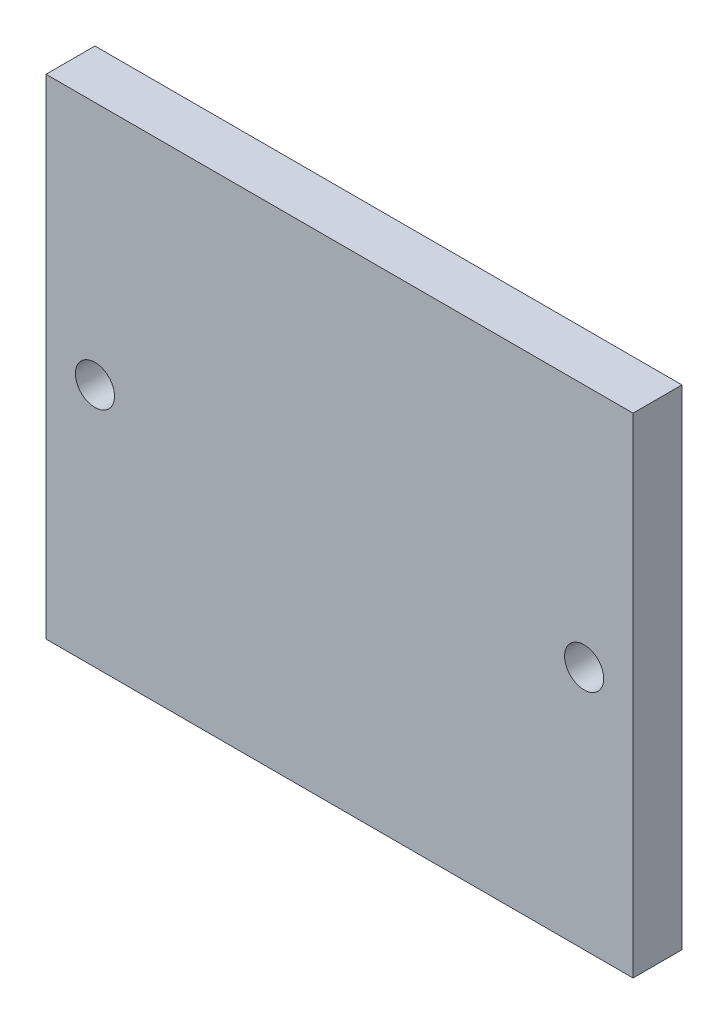
ISO-10303-21;
HEADER;
FILE_DESCRIPTION(('STEP AP214'),'2;1');
FILE_NAME('part.step','',(''),(''),'','','');
FILE_SCHEMA(('AUTOMOTIVE_DESIGN { 1 0 10303 214 1 1 1 1 }'));
ENDSEC;
DATA;
#1=APPLICATION_CONTEXT('core data for automotive mechanical design processes');
#2=APPLICATION_PROTOCOL_DEFINITION('international standard','automotive_design',2000,#1);
#3=PRODUCT_CONTEXT('',#1,'mechanical');
#4=PRODUCT('Part','Part','',(#3));
#5=PRODUCT_RELATED_PRODUCT_CATEGORY('part','',(#4));
#6=PRODUCT_DEFINITION_FORMATION('','',#4);
#7=PRODUCT_DEFINITION_CONTEXT('part definition',#1,'design');
#8=PRODUCT_DEFINITION('design','',#6,#7);
#9=PRODUCT_DEFINITION_SHAPE('','',#8);
#10=(LENGTH_UNIT() NAMED_UNIT(*) SI_UNIT(.MILLI.,.METRE.));
#11=(NAMED_UNIT(*) PLANE_ANGLE_UNIT() SI_UNIT($,.RADIAN.));
#12=(NAMED_UNIT(*) SI_UNIT($,.STERADIAN.) SOLID_ANGLE_UNIT());
#13=UNCERTAINTY_MEASURE_WITH_UNIT(LENGTH_MEASURE(1.E-05),#10,'distance_accuracy_value','');
#14=(GEOMETRIC_REPRESENTATION_CONTEXT(3) GLOBAL_UNCERTAINTY_ASSIGNED_CONTEXT((#13)) GLOBAL_UNIT_ASSIGNED_CONTEXT((#10,
#11,#12)) REPRESENTATION_CONTEXT('',''));
#15=CARTESIAN_POINT('',(0.,0.,0.));
#16=DIRECTION('',(0.,0.,1.));
#17=DIRECTION('',(1.,0.,0.));
#18=AXIS2_PLACEMENT_3D('',#15,#16,#17);
#19=CARTESIAN_POINT('',(0.,0.,5.));
#20=DIRECTION('',(0.,0.,1.));
#21=DIRECTION('',(1.,0.,0.));
#22=AXIS2_PLACEMENT_3D('',#19,#20,#21);
#23=PLANE('',#22);
#24=CARTESIAN_POINT('',(25.,0.,5.));
#25=DIRECTION('',(0.,0.,1.));
#26=DIRECTION('',(1.,0.,0.));
#27=AXIS2_PLACEMENT_3D('',#24,#25,#26);
#28=CIRCLE('',#27,2.);
#29=CARTESIAN_POINT('',(27.,0.,5.));
#30=VERTEX_POINT('',#29);
#31=EDGE_CURVE('E100',#30,#30,#28,.T.);
#32=ORIENTED_EDGE('',*,*,#31,.F.);
#33=EDGE_LOOP('',(#32));
#34=FACE_BOUND('',#33,.T.);
#35=DIRECTION('',(0.,1.,0.));
#36=VECTOR('',#35,1.);
#37=CARTESIAN_POINT('',(30.,25.,5.));
#38=LINE('',#37,#36);
#39=CARTESIAN_POINT('',(30.,-25.,5.));
#40=VERTEX_POINT('',#39);
#41=CARTESIAN_POINT('',(30.,25.,5.));
#42=VERTEX_POINT('',#41);
#43=EDGE_CURVE('E85',#40,#42,#38,.T.);
#44=ORIENTED_EDGE('',*,*,#43,.T.);
#45=DIRECTION('',(-1.,0.,0.));
#46=VECTOR('',#45,1.);
#47=CARTESIAN_POINT('',(-30.,25.,5.));
#48=LINE('',#47,#46);
#49=CARTESIAN_POINT('',(-30.,25.,5.));
#50=VERTEX_POINT('',#49);
#51=EDGE_CURVE('E80',#42,#50,#48,.T.);
#52=ORIENTED_EDGE('',*,*,#51,.T.);
#53=DIRECTION('',(0.,-1.,0.));
#54=VECTOR('',#53,1.);
#55=CARTESIAN_POINT('',(-30.,25.,5.));
#56=LINE('',#55,#54);
#57=CARTESIAN_POINT('',(-30.,-25.,5.));
#58=VERTEX_POINT('',#57);
#59=EDGE_CURVE('E83',#50,#58,#56,.T.);
#60=ORIENTED_EDGE('',*,*,#59,.T.);
#61=DIRECTION('',(1.,0.,0.));
#62=VECTOR('',#61,1.);
#63=CARTESIAN_POINT('',(-30.,-25.,5.));
#64=LINE('',#63,#62);
#65=EDGE_CURVE('E50',#58,#40,#64,.T.);
#66=ORIENTED_EDGE('',*,*,#65,.T.);
#67=EDGE_LOOP('',(#44,#52,#60,#66));
#68=FACE_BOUND('',#67,.T.);
#69=CARTESIAN_POINT('',(-25.,0.,5.));
#70=DIRECTION('',(0.,0.,1.));
#71=DIRECTION('',(-1.,0.,0.));
#72=AXIS2_PLACEMENT_3D('',#69,#70,#71);
#73=CIRCLE('',#72,2.);
#74=CARTESIAN_POINT('',(-27.,0.,5.));
#75=VERTEX_POINT('',#74);
#76=EDGE_CURVE('E115',#75,#75,#73,.T.);
#77=ORIENTED_EDGE('',*,*,#76,.F.);
#78=EDGE_LOOP('',(#77));
#79=FACE_BOUND('',#78,.T.);
#80=ADVANCED_FACE('F33',(#34,#68,#79),#23,.T.);
#81=CARTESIAN_POINT('',(0.,0.,0.));
#82=DIRECTION('',(0.,0.,1.));
#83=DIRECTION('',(1.,0.,0.));
#84=AXIS2_PLACEMENT_3D('',#81,#82,#83);
#85=PLANE('',#84);
#86=DIRECTION('',(0.,1.,0.));
#87=VECTOR('',#86,1.);
#88=CARTESIAN_POINT('',(30.,25.,0.));
#89=LINE('',#88,#87);
#90=CARTESIAN_POINT('',(30.,-25.,0.));
#91=VERTEX_POINT('',#90);
#92=CARTESIAN_POINT('',(30.,25.,0.));
#93=VERTEX_POINT('',#92);
#94=EDGE_CURVE('E97',#91,#93,#89,.T.);
#95=ORIENTED_EDGE('',*,*,#94,.F.);
#96=DIRECTION('',(1.,0.,0.));
#97=VECTOR('',#96,1.);
#98=CARTESIAN_POINT('',(-30.,-25.,0.));
#99=LINE('',#98,#97);
#100=CARTESIAN_POINT('',(-30.,-25.,0.));
#101=VERTEX_POINT('',#100);
#102=EDGE_CURVE('E73',#101,#91,#99,.T.);
#103=ORIENTED_EDGE('',*,*,#102,.F.);
#104=DIRECTION('',(0.,-1.,0.));
#105=VECTOR('',#104,1.);
#106=CARTESIAN_POINT('',(-30.,25.,0.));
#107=LINE('',#106,#105);
#108=CARTESIAN_POINT('',(-30.,25.,0.));
#109=VERTEX_POINT('',#108);
#110=EDGE_CURVE('E67',#109,#101,#107,.T.);
#111=ORIENTED_EDGE('',*,*,#110,.F.);
#112=DIRECTION('',(-1.,0.,0.));
#113=VECTOR('',#112,1.);
#114=CARTESIAN_POINT('',(-30.,25.,0.));
#115=LINE('',#114,#113);
#116=EDGE_CURVE('E89',#93,#109,#115,.T.);
#117=ORIENTED_EDGE('',*,*,#116,.F.);
#118=EDGE_LOOP('',(#95,#103,#111,#117));
#119=FACE_BOUND('',#118,.T.);
#120=CARTESIAN_POINT('',(25.,0.,0.));
#121=DIRECTION('',(0.,0.,1.));
#122=DIRECTION('',(1.,0.,0.));
#123=AXIS2_PLACEMENT_3D('',#120,#121,#122);
#124=CIRCLE('',#123,2.);
#125=CARTESIAN_POINT('',(27.,0.,0.));
#126=VERTEX_POINT('',#125);
#127=EDGE_CURVE('E112',#126,#126,#124,.T.);
#128=ORIENTED_EDGE('',*,*,#127,.T.);
#129=EDGE_LOOP('',(#128));
#130=FACE_BOUND('',#129,.T.);
#131=CARTESIAN_POINT('',(-25.,0.,0.));
#132=DIRECTION('',(0.,0.,1.));
#133=DIRECTION('',(-1.,0.,0.));
#134=AXIS2_PLACEMENT_3D('',#131,#132,#133);
#135=CIRCLE('',#134,2.);
#136=CARTESIAN_POINT('',(-27.,0.,0.));
#137=VERTEX_POINT('',#136);
#138=EDGE_CURVE('E118',#137,#137,#135,.T.);
#139=ORIENTED_EDGE('',*,*,#138,.T.);
#140=EDGE_LOOP('',(#139));
#141=FACE_BOUND('',#140,.T.);
#142=ADVANCED_FACE('F108',(#119,#130,#141),#85,.F.);
#143=CARTESIAN_POINT('',(30.,25.,5.));
#144=DIRECTION('',(-1.,0.,0.));
#145=DIRECTION('',(0.,-1.,0.));
#146=AXIS2_PLACEMENT_3D('',#143,#144,#145);
#147=PLANE('',#146);
#148=ORIENTED_EDGE('',*,*,#94,.T.);
#149=DIRECTION('',(0.,0.,-1.));
#150=VECTOR('',#149,1.);
#151=CARTESIAN_POINT('',(30.,25.,5.));
#152=LINE('',#151,#150);
#153=EDGE_CURVE('E11',#42,#93,#152,.T.);
#154=ORIENTED_EDGE('',*,*,#153,.F.);
#155=ORIENTED_EDGE('',*,*,#43,.F.);
#156=DIRECTION('',(0.,0.,-1.));
#157=VECTOR('',#156,1.);
#158=CARTESIAN_POINT('',(30.,-25.,5.));
#159=LINE('',#158,#157);
#160=EDGE_CURVE('E93',#40,#91,#159,.T.);
#161=ORIENTED_EDGE('',*,*,#160,.T.);
#162=EDGE_LOOP('',(#148,#154,#155,#161));
#163=FACE_BOUND('',#162,.T.);
#164=ADVANCED_FACE('F35',(#163),#147,.F.);
#165=CARTESIAN_POINT('',(-30.,25.,5.));
#166=DIRECTION('',(0.,-1.,0.));
#167=DIRECTION('',(0.,0.,-1.));
#168=AXIS2_PLACEMENT_3D('',#165,#166,#167);
#169=PLANE('',#168);
#170=ORIENTED_EDGE('',*,*,#116,.T.);
#171=DIRECTION('',(0.,0.,-1.));
#172=VECTOR('',#171,1.);
#173=CARTESIAN_POINT('',(-30.,25.,5.));
#174=LINE('',#173,#172);
#175=EDGE_CURVE('E42',#50,#109,#174,.T.);
#176=ORIENTED_EDGE('',*,*,#175,.F.);
#177=ORIENTED_EDGE('',*,*,#51,.F.);
#178=ORIENTED_EDGE('',*,*,#153,.T.);
#179=EDGE_LOOP('',(#170,#176,#177,#178));
#180=FACE_BOUND('',#179,.T.);
#181=ADVANCED_FACE('F88',(#180),#169,.F.);
#182=CARTESIAN_POINT('',(-30.,25.,5.));
#183=DIRECTION('',(1.,0.,0.));
#184=DIRECTION('',(0.,1.,0.));
#185=AXIS2_PLACEMENT_3D('',#182,#183,#184);
#186=PLANE('',#185);
#187=ORIENTED_EDGE('',*,*,#110,.T.);
#188=DIRECTION('',(0.,0.,-1.));
#189=VECTOR('',#188,1.);
#190=CARTESIAN_POINT('',(-30.,-25.,5.));
#191=LINE('',#190,#189);
#192=EDGE_CURVE('E90',#58,#101,#191,.T.);
#193=ORIENTED_EDGE('',*,*,#192,.F.);
#194=ORIENTED_EDGE('',*,*,#59,.F.);
#195=ORIENTED_EDGE('',*,*,#175,.T.);
#196=EDGE_LOOP('',(#187,#193,#194,#195));
#197=FACE_BOUND('',#196,.T.);
#198=ADVANCED_FACE('F91',(#197),#186,.F.);
#199=CARTESIAN_POINT('',(-30.,-25.,5.));
#200=DIRECTION('',(0.,1.,0.));
#201=DIRECTION('',(0.,0.,1.));
#202=AXIS2_PLACEMENT_3D('',#199,#200,#201);
#203=PLANE('',#202);
#204=ORIENTED_EDGE('',*,*,#102,.T.);
#205=ORIENTED_EDGE('',*,*,#160,.F.);
#206=ORIENTED_EDGE('',*,*,#65,.F.);
#207=ORIENTED_EDGE('',*,*,#192,.T.);
#208=EDGE_LOOP('',(#204,#205,#206,#207));
#209=FACE_BOUND('',#208,.T.);
#210=ADVANCED_FACE('F105',(#209),#203,.F.);
#211=CARTESIAN_POINT('',(25.,0.,5.));
#212=DIRECTION('',(0.,0.,-1.));
#213=DIRECTION('',(-1.,0.,0.));
#214=AXIS2_PLACEMENT_3D('',#211,#212,#213);
#215=CYLINDRICAL_SURFACE('',#214,2.);
#216=ORIENTED_EDGE('',*,*,#31,.T.);
#217=EDGE_LOOP('',(#216));
#218=FACE_BOUND('',#217,.T.);
#219=ORIENTED_EDGE('',*,*,#127,.F.);
#220=EDGE_LOOP('',(#219));
#221=FACE_BOUND('',#220,.T.);
#222=ADVANCED_FACE('F135',(#218,#221),#215,.F.);
#223=CARTESIAN_POINT('',(-25.,0.,5.));
#224=DIRECTION('',(0.,0.,-1.));
#225=DIRECTION('',(-1.,0.,0.));
#226=AXIS2_PLACEMENT_3D('',#223,#224,#225);
#227=CYLINDRICAL_SURFACE('',#226,2.);
#228=ORIENTED_EDGE('',*,*,#76,.T.);
#229=EDGE_LOOP('',(#228));
#230=FACE_BOUND('',#229,.T.);
#231=ORIENTED_EDGE('',*,*,#138,.F.);
#232=EDGE_LOOP('',(#231));
#233=FACE_BOUND('',#232,.T.);
#234=ADVANCED_FACE('F124',(#230,#233),#227,.F.);
#235=CLOSED_SHELL('',(#80,#142,#164,#181,#198,#210,#222,#234));
#236=MANIFOLD_SOLID_BREP('B2',#235);
#237=ADVANCED_BREP_SHAPE_REPRESENTATION('',(#18,#236),#14);
#238=SHAPE_DEFINITION_REPRESENTATION(#9,#237);
ENDSEC;
END-ISO-10303-21;
